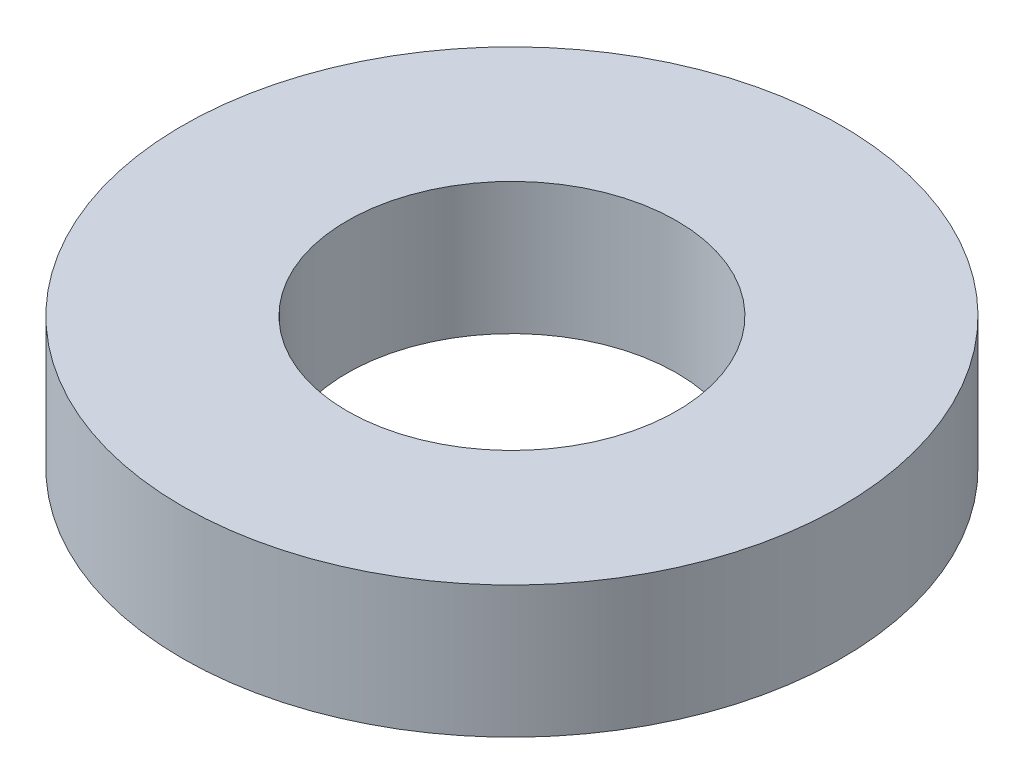
ISO-10303-21;
HEADER;
FILE_DESCRIPTION(('STEP AP214'),'2;1');
FILE_NAME('part.step','',(''),(''),'','','');
FILE_SCHEMA(('AUTOMOTIVE_DESIGN { 1 0 10303 214 1 1 1 1 }'));
ENDSEC;
DATA;
#1=APPLICATION_CONTEXT('core data for automotive mechanical design processes');
#2=APPLICATION_PROTOCOL_DEFINITION('international standard','automotive_design',2000,#1);
#3=PRODUCT_CONTEXT('',#1,'mechanical');
#4=PRODUCT('Part','Part','',(#3));
#5=PRODUCT_RELATED_PRODUCT_CATEGORY('part','',(#4));
#6=PRODUCT_DEFINITION_FORMATION('','',#4);
#7=PRODUCT_DEFINITION_CONTEXT('part definition',#1,'design');
#8=PRODUCT_DEFINITION('design','',#6,#7);
#9=PRODUCT_DEFINITION_SHAPE('','',#8);
#10=(LENGTH_UNIT() NAMED_UNIT(*) SI_UNIT(.MILLI.,.METRE.));
#11=(NAMED_UNIT(*) PLANE_ANGLE_UNIT() SI_UNIT($,.RADIAN.));
#12=(NAMED_UNIT(*) SI_UNIT($,.STERADIAN.) SOLID_ANGLE_UNIT());
#13=UNCERTAINTY_MEASURE_WITH_UNIT(LENGTH_MEASURE(1.E-05),#10,'distance_accuracy_value','');
#14=(GEOMETRIC_REPRESENTATION_CONTEXT(3) GLOBAL_UNCERTAINTY_ASSIGNED_CONTEXT((#13)) GLOBAL_UNIT_ASSIGNED_CONTEXT((#10,
#11,#12)) REPRESENTATION_CONTEXT('',''));
#15=CARTESIAN_POINT('',(0.,0.,0.));
#16=DIRECTION('',(0.,0.,1.));
#17=DIRECTION('',(1.,0.,0.));
#18=AXIS2_PLACEMENT_3D('',#15,#16,#17);
#19=CARTESIAN_POINT('',(0.,4.,0.));
#20=DIRECTION('',(0.,1.,0.));
#21=DIRECTION('',(0.,0.,1.));
#22=AXIS2_PLACEMENT_3D('',#19,#20,#21);
#23=PLANE('',#22);
#24=CARTESIAN_POINT('',(0.,4.,0.));
#25=DIRECTION('',(0.,1.,0.));
#26=DIRECTION('',(0.,0.,1.));
#27=AXIS2_PLACEMENT_3D('',#24,#25,#26);
#28=CIRCLE('',#27,10.);
#29=CARTESIAN_POINT('',(0.,4.,10.));
#30=VERTEX_POINT('',#29);
#31=EDGE_CURVE('E10',#30,#30,#28,.T.);
#32=ORIENTED_EDGE('',*,*,#31,.T.);
#33=EDGE_LOOP('',(#32));
#34=FACE_BOUND('',#33,.T.);
#35=CARTESIAN_POINT('',(0.,4.,0.));
#36=DIRECTION('',(0.,1.,0.));
#37=DIRECTION('',(0.,0.,1.));
#38=AXIS2_PLACEMENT_3D('',#35,#36,#37);
#39=CIRCLE('',#38,5.);
#40=CARTESIAN_POINT('',(0.,4.,5.));
#41=VERTEX_POINT('',#40);
#42=EDGE_CURVE('E50',#41,#41,#39,.T.);
#43=ORIENTED_EDGE('',*,*,#42,.F.);
#44=EDGE_LOOP('',(#43));
#45=FACE_BOUND('',#44,.T.);
#46=ADVANCED_FACE('F37',(#34,#45),#23,.T.);
#47=CARTESIAN_POINT('',(0.,0.,0.));
#48=DIRECTION('',(0.,1.,0.));
#49=DIRECTION('',(0.,0.,1.));
#50=AXIS2_PLACEMENT_3D('',#47,#48,#49);
#51=PLANE('',#50);
#52=CARTESIAN_POINT('',(0.,0.,0.));
#53=DIRECTION('',(0.,1.,0.));
#54=DIRECTION('',(0.,0.,1.));
#55=AXIS2_PLACEMENT_3D('',#52,#53,#54);
#56=CIRCLE('',#55,10.);
#57=CARTESIAN_POINT('',(0.,0.,10.));
#58=VERTEX_POINT('',#57);
#59=EDGE_CURVE('E41',#58,#58,#56,.T.);
#60=ORIENTED_EDGE('',*,*,#59,.F.);
#61=EDGE_LOOP('',(#60));
#62=FACE_BOUND('',#61,.T.);
#63=CARTESIAN_POINT('',(0.,0.,0.));
#64=DIRECTION('',(0.,1.,0.));
#65=DIRECTION('',(0.,0.,1.));
#66=AXIS2_PLACEMENT_3D('',#63,#64,#65);
#67=CIRCLE('',#66,5.);
#68=CARTESIAN_POINT('',(0.,0.,5.));
#69=VERTEX_POINT('',#68);
#70=EDGE_CURVE('E52',#69,#69,#67,.T.);
#71=ORIENTED_EDGE('',*,*,#70,.T.);
#72=EDGE_LOOP('',(#71));
#73=FACE_BOUND('',#72,.T.);
#74=ADVANCED_FACE('F64',(#62,#73),#51,.F.);
#75=CARTESIAN_POINT('',(0.,4.,0.));
#76=DIRECTION('',(0.,-1.,0.));
#77=DIRECTION('',(0.,0.,-1.));
#78=AXIS2_PLACEMENT_3D('',#75,#76,#77);
#79=CYLINDRICAL_SURFACE('',#78,10.);
#80=ORIENTED_EDGE('',*,*,#31,.F.);
#81=EDGE_LOOP('',(#80));
#82=FACE_BOUND('',#81,.T.);
#83=ORIENTED_EDGE('',*,*,#59,.T.);
#84=EDGE_LOOP('',(#83));
#85=FACE_BOUND('',#84,.T.);
#86=ADVANCED_FACE('F39',(#82,#85),#79,.T.);
#87=CARTESIAN_POINT('',(0.,4.,0.));
#88=DIRECTION('',(0.,-1.,0.));
#89=DIRECTION('',(0.,0.,-1.));
#90=AXIS2_PLACEMENT_3D('',#87,#88,#89);
#91=CYLINDRICAL_SURFACE('',#90,5.);
#92=ORIENTED_EDGE('',*,*,#42,.T.);
#93=EDGE_LOOP('',(#92));
#94=FACE_BOUND('',#93,.T.);
#95=ORIENTED_EDGE('',*,*,#70,.F.);
#96=EDGE_LOOP('',(#95));
#97=FACE_BOUND('',#96,.T.);
#98=ADVANCED_FACE('F60',(#94,#97),#91,.F.);
#99=CLOSED_SHELL('',(#46,#74,#86,#98));
#100=MANIFOLD_SOLID_BREP('B2',#99);
#101=ADVANCED_BREP_SHAPE_REPRESENTATION('',(#18,#100),#14);
#102=SHAPE_DEFINITION_REPRESENTATION(#9,#101);
ENDSEC;
END-ISO-10303-21;
